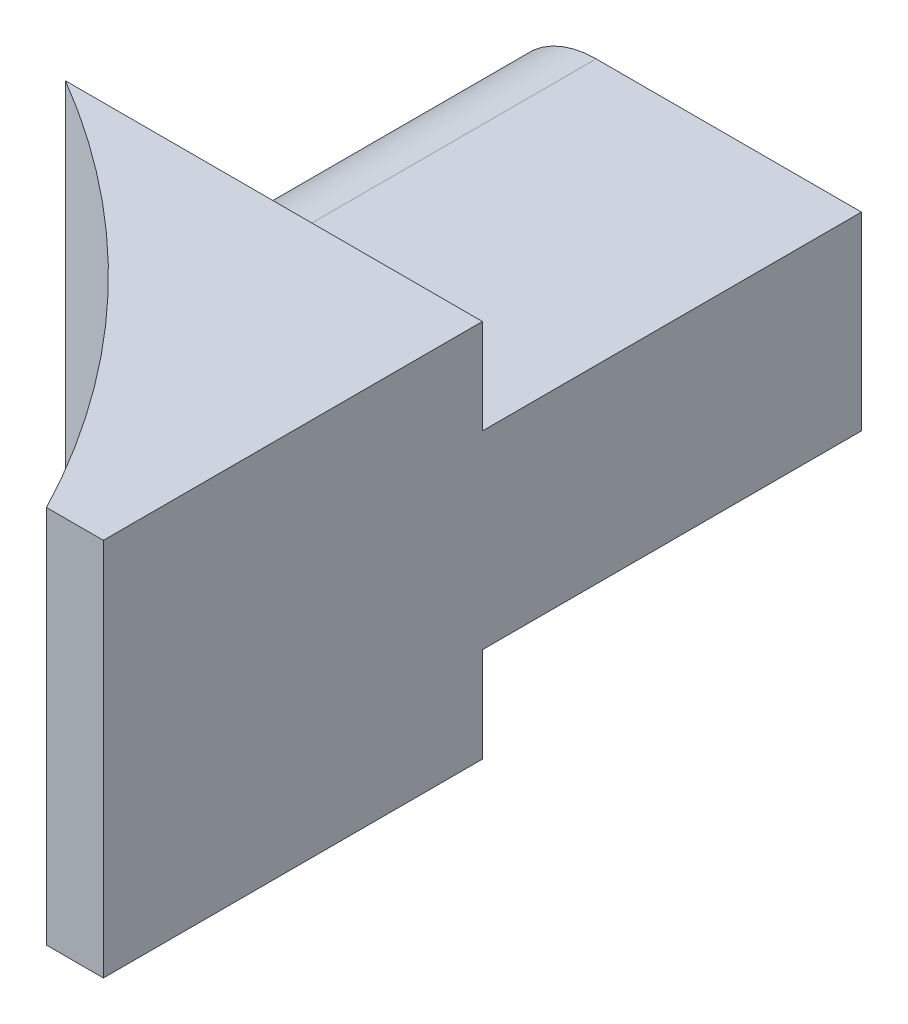
ISO-10303-21;
HEADER;
FILE_DESCRIPTION(('STEP AP214'),'2;1');
FILE_NAME('part.step','',(''),(''),'','','');
FILE_SCHEMA(('AUTOMOTIVE_DESIGN { 1 0 10303 214 1 1 1 1 }'));
ENDSEC;
DATA;
#1=APPLICATION_CONTEXT('core data for automotive mechanical design processes');
#2=APPLICATION_PROTOCOL_DEFINITION('international standard','automotive_design',2000,#1);
#3=PRODUCT_CONTEXT('',#1,'mechanical');
#4=PRODUCT('Part','Part','',(#3));
#5=PRODUCT_RELATED_PRODUCT_CATEGORY('part','',(#4));
#6=PRODUCT_DEFINITION_FORMATION('','',#4);
#7=PRODUCT_DEFINITION_CONTEXT('part definition',#1,'design');
#8=PRODUCT_DEFINITION('design','',#6,#7);
#9=PRODUCT_DEFINITION_SHAPE('','',#8);
#10=(LENGTH_UNIT() NAMED_UNIT(*) SI_UNIT(.MILLI.,.METRE.));
#11=(NAMED_UNIT(*) PLANE_ANGLE_UNIT() SI_UNIT($,.RADIAN.));
#12=(NAMED_UNIT(*) SI_UNIT($,.STERADIAN.) SOLID_ANGLE_UNIT());
#13=UNCERTAINTY_MEASURE_WITH_UNIT(LENGTH_MEASURE(1.E-05),#10,'distance_accuracy_value','');
#14=(GEOMETRIC_REPRESENTATION_CONTEXT(3) GLOBAL_UNCERTAINTY_ASSIGNED_CONTEXT((#13)) GLOBAL_UNIT_ASSIGNED_CONTEXT((#10,
#11,#12)) REPRESENTATION_CONTEXT('',''));
#15=CARTESIAN_POINT('',(0.,0.,0.));
#16=DIRECTION('',(0.,0.,1.));
#17=DIRECTION('',(1.,0.,0.));
#18=AXIS2_PLACEMENT_3D('',#15,#16,#17);
#19=CARTESIAN_POINT('',(0.,0.,10.));
#20=DIRECTION('',(0.,0.,-1.));
#21=DIRECTION('',(-1.,0.,0.));
#22=AXIS2_PLACEMENT_3D('',#19,#20,#21);
#23=CYLINDRICAL_SURFACE('',#22,2.5);
#24=DIRECTION('',(0.,0.,-1.));
#25=VECTOR('',#24,1.);
#26=CARTESIAN_POINT('',(0.,-2.5,10.));
#27=LINE('',#26,#25);
#28=CARTESIAN_POINT('',(0.,-2.5,10.));
#29=VERTEX_POINT('',#28);
#30=CARTESIAN_POINT('',(0.,-2.5,0.));
#31=VERTEX_POINT('',#30);
#32=EDGE_CURVE('E187',#29,#31,#27,.T.);
#33=ORIENTED_EDGE('',*,*,#32,.F.);
#34=CARTESIAN_POINT('',(0.,0.,10.));
#35=DIRECTION('',(0.,0.,1.));
#36=DIRECTION('',(1.,0.,0.));
#37=AXIS2_PLACEMENT_3D('',#34,#35,#36);
#38=CIRCLE('',#37,2.5);
#39=CARTESIAN_POINT('',(0.,2.5,10.));
#40=VERTEX_POINT('',#39);
#41=EDGE_CURVE('E121',#40,#29,#38,.T.);
#42=ORIENTED_EDGE('',*,*,#41,.F.);
#43=DIRECTION('',(0.,0.,-1.));
#44=VECTOR('',#43,1.);
#45=CARTESIAN_POINT('',(0.,2.5,10.));
#46=LINE('',#45,#44);
#47=CARTESIAN_POINT('',(0.,2.5,0.));
#48=VERTEX_POINT('',#47);
#49=EDGE_CURVE('E48',#40,#48,#46,.T.);
#50=ORIENTED_EDGE('',*,*,#49,.T.);
#51=CARTESIAN_POINT('',(0.,0.,0.));
#52=DIRECTION('',(0.,0.,1.));
#53=DIRECTION('',(1.,0.,0.));
#54=AXIS2_PLACEMENT_3D('',#51,#52,#53);
#55=CIRCLE('',#54,2.5);
#56=EDGE_CURVE('E120',#48,#31,#55,.T.);
#57=ORIENTED_EDGE('',*,*,#56,.T.);
#58=EDGE_LOOP('',(#33,#42,#50,#57));
#59=FACE_BOUND('',#58,.T.);
#60=ADVANCED_FACE('F33',(#59),#23,.T.);
#61=CARTESIAN_POINT('',(0.,0.,0.));
#62=DIRECTION('',(0.,0.,1.));
#63=DIRECTION('',(1.,0.,0.));
#64=AXIS2_PLACEMENT_3D('',#61,#62,#63);
#65=PLANE('',#64);
#66=CARTESIAN_POINT('',(0.,0.,0.));
#67=DIRECTION('',(0.,0.,-1.));
#68=DIRECTION('',(-1.,0.,0.));
#69=AXIS2_PLACEMENT_3D('',#66,#67,#68);
#70=CIRCLE('',#69,1.5);
#71=CARTESIAN_POINT('',(-1.5,0.,0.));
#72=VERTEX_POINT('',#71);
#73=EDGE_CURVE('E117',#72,#72,#70,.T.);
#74=ORIENTED_EDGE('',*,*,#73,.F.);
#75=EDGE_LOOP('',(#74));
#76=FACE_BOUND('',#75,.T.);
#77=ORIENTED_EDGE('',*,*,#56,.F.);
#78=DIRECTION('',(1.,0.,0.));
#79=VECTOR('',#78,1.);
#80=CARTESIAN_POINT('',(7.,2.5,0.));
#81=LINE('',#80,#79);
#82=CARTESIAN_POINT('',(7.,2.5,0.));
#83=VERTEX_POINT('',#82);
#84=EDGE_CURVE('E198',#48,#83,#81,.T.);
#85=ORIENTED_EDGE('',*,*,#84,.T.);
#86=DIRECTION('',(0.,-1.,0.));
#87=VECTOR('',#86,1.);
#88=CARTESIAN_POINT('',(7.,-2.5,0.));
#89=LINE('',#88,#87);
#90=CARTESIAN_POINT('',(7.,-2.5,0.));
#91=VERTEX_POINT('',#90);
#92=EDGE_CURVE('E194',#83,#91,#89,.T.);
#93=ORIENTED_EDGE('',*,*,#92,.T.);
#94=DIRECTION('',(-1.,0.,0.));
#95=VECTOR('',#94,1.);
#96=CARTESIAN_POINT('',(0.,-2.5,0.));
#97=LINE('',#96,#95);
#98=EDGE_CURVE('E180',#91,#31,#97,.T.);
#99=ORIENTED_EDGE('',*,*,#98,.T.);
#100=EDGE_LOOP('',(#77,#85,#93,#99));
#101=FACE_BOUND('',#100,.T.);
#102=ADVANCED_FACE('F143',(#76,#101),#65,.F.);
#103=CARTESIAN_POINT('',(0.,0.,0.9));
#104=DIRECTION('',(0.,0.,-1.));
#105=DIRECTION('',(-1.,0.,0.));
#106=AXIS2_PLACEMENT_3D('',#103,#104,#105);
#107=CYLINDRICAL_SURFACE('',#106,1.5);
#108=CARTESIAN_POINT('',(0.,0.,0.8));
#109=DIRECTION('',(0.,0.,-1.));
#110=DIRECTION('',(-1.,0.,0.));
#111=AXIS2_PLACEMENT_3D('',#108,#109,#110);
#112=CIRCLE('',#111,1.5);
#113=CARTESIAN_POINT('',(-1.5,0.,0.8));
#114=VERTEX_POINT('',#113);
#115=EDGE_CURVE('E11',#114,#114,#112,.F.);
#116=ORIENTED_EDGE('',*,*,#115,.T.);
#117=EDGE_LOOP('',(#116));
#118=FACE_BOUND('',#117,.T.);
#119=ORIENTED_EDGE('',*,*,#73,.T.);
#120=EDGE_LOOP('',(#119));
#121=FACE_BOUND('',#120,.T.);
#122=ADVANCED_FACE('F139',(#118,#121),#107,.F.);
#123=CARTESIAN_POINT('',(0.,0.,0.9));
#124=DIRECTION('',(0.,0.,-1.));
#125=DIRECTION('',(-1.,0.,0.));
#126=AXIS2_PLACEMENT_3D('',#123,#124,#125);
#127=PLANE('',#126);
#128=CARTESIAN_POINT('',(0.,0.,0.9));
#129=DIRECTION('',(0.,0.,-1.));
#130=DIRECTION('',(-1.,0.,0.));
#131=AXIS2_PLACEMENT_3D('',#128,#129,#130);
#132=CIRCLE('',#131,1.4);
#133=CARTESIAN_POINT('',(-1.4,0.,0.9));
#134=VERTEX_POINT('',#133);
#135=EDGE_CURVE('E41',#134,#134,#132,.T.);
#136=ORIENTED_EDGE('',*,*,#135,.T.);
#137=EDGE_LOOP('',(#136));
#138=FACE_BOUND('',#137,.T.);
#139=ADVANCED_FACE('F127',(#138),#127,.T.);
#140=CARTESIAN_POINT('',(0.,0.,0.8));
#141=DIRECTION('',(0.,0.,-1.));
#142=DIRECTION('',(-1.,0.,0.));
#143=AXIS2_PLACEMENT_3D('',#140,#141,#142);
#144=TOROIDAL_SURFACE('',#143,1.4,0.1);
#145=ORIENTED_EDGE('',*,*,#115,.F.);
#146=EDGE_LOOP('',(#145));
#147=FACE_BOUND('',#146,.T.);
#148=ORIENTED_EDGE('',*,*,#135,.F.);
#149=EDGE_LOOP('',(#148));
#150=FACE_BOUND('',#149,.T.);
#151=ADVANCED_FACE('F35',(#147,#150),#144,.F.);
#152=CARTESIAN_POINT('',(-4.,-5.,20.));
#153=DIRECTION('',(0.,1.,0.));
#154=DIRECTION('',(0.,0.,1.));
#155=AXIS2_PLACEMENT_3D('',#152,#153,#154);
#156=PLANE('',#155);
#157=DIRECTION('',(1.,0.,0.));
#158=VECTOR('',#157,1.);
#159=CARTESIAN_POINT('',(-4.,-5.,20.));
#160=LINE('',#159,#158);
#161=CARTESIAN_POINT('',(5.5,-5.,20.));
#162=VERTEX_POINT('',#161);
#163=CARTESIAN_POINT('',(7.,-5.,20.));
#164=VERTEX_POINT('',#163);
#165=EDGE_CURVE('E95',#162,#164,#160,.T.);
#166=ORIENTED_EDGE('',*,*,#165,.F.);
#167=CARTESIAN_POINT('',(-16.6716850991842,-5.,31.550600844225));
#168=DIRECTION('',(0.,-1.,0.));
#169=DIRECTION('',(0.,0.,1.));
#170=AXIS2_PLACEMENT_3D('',#167,#168,#169);
#171=CIRCLE('',#170,25.);
#172=CARTESIAN_POINT('',(-4.,-5.,10.));
#173=VERTEX_POINT('',#172);
#174=EDGE_CURVE('E86',#173,#162,#171,.T.);
#175=ORIENTED_EDGE('',*,*,#174,.F.);
#176=DIRECTION('',(1.,0.,0.));
#177=VECTOR('',#176,1.);
#178=CARTESIAN_POINT('',(-4.,-5.,10.));
#179=LINE('',#178,#177);
#180=CARTESIAN_POINT('',(7.,-5.,10.));
#181=VERTEX_POINT('',#180);
#182=EDGE_CURVE('E102',#173,#181,#179,.T.);
#183=ORIENTED_EDGE('',*,*,#182,.T.);
#184=DIRECTION('',(0.,0.,-1.));
#185=VECTOR('',#184,1.);
#186=CARTESIAN_POINT('',(7.,-5.,20.));
#187=LINE('',#186,#185);
#188=EDGE_CURVE('E114',#164,#181,#187,.T.);
#189=ORIENTED_EDGE('',*,*,#188,.F.);
#190=EDGE_LOOP('',(#166,#175,#183,#189));
#191=FACE_BOUND('',#190,.T.);
#192=ADVANCED_FACE('F130',(#191),#156,.F.);
#193=CARTESIAN_POINT('',(7.,5.,20.));
#194=DIRECTION('',(-1.,0.,0.));
#195=DIRECTION('',(0.,-1.,0.));
#196=AXIS2_PLACEMENT_3D('',#193,#194,#195);
#197=PLANE('',#196);
#198=DIRECTION('',(0.,1.,0.));
#199=VECTOR('',#198,1.);
#200=CARTESIAN_POINT('',(7.,5.,10.));
#201=LINE('',#200,#199);
#202=CARTESIAN_POINT('',(7.,-2.5,10.));
#203=VERTEX_POINT('',#202);
#204=EDGE_CURVE('E96',#181,#203,#201,.T.);
#205=ORIENTED_EDGE('',*,*,#204,.T.);
#206=DIRECTION('',(0.,0.,-1.));
#207=VECTOR('',#206,1.);
#208=CARTESIAN_POINT('',(7.,-2.5,10.));
#209=LINE('',#208,#207);
#210=EDGE_CURVE('E184',#203,#91,#209,.T.);
#211=ORIENTED_EDGE('',*,*,#210,.T.);
#212=ORIENTED_EDGE('',*,*,#92,.F.);
#213=DIRECTION('',(0.,0.,-1.));
#214=VECTOR('',#213,1.);
#215=CARTESIAN_POINT('',(7.,2.5,10.));
#216=LINE('',#215,#214);
#217=CARTESIAN_POINT('',(7.,2.5,10.));
#218=VERTEX_POINT('',#217);
#219=EDGE_CURVE('E204',#218,#83,#216,.T.);
#220=ORIENTED_EDGE('',*,*,#219,.F.);
#221=CARTESIAN_POINT('',(7.,5.,10.));
#222=VERTEX_POINT('',#221);
#223=EDGE_CURVE('E104',#218,#222,#201,.T.);
#224=ORIENTED_EDGE('',*,*,#223,.T.);
#225=DIRECTION('',(0.,0.,-1.));
#226=VECTOR('',#225,1.);
#227=CARTESIAN_POINT('',(7.,5.,20.));
#228=LINE('',#227,#226);
#229=CARTESIAN_POINT('',(7.,5.,20.));
#230=VERTEX_POINT('',#229);
#231=EDGE_CURVE('E92',#230,#222,#228,.T.);
#232=ORIENTED_EDGE('',*,*,#231,.F.);
#233=DIRECTION('',(0.,1.,0.));
#234=VECTOR('',#233,1.);
#235=CARTESIAN_POINT('',(7.,5.,20.));
#236=LINE('',#235,#234);
#237=EDGE_CURVE('E57',#164,#230,#236,.T.);
#238=ORIENTED_EDGE('',*,*,#237,.F.);
#239=ORIENTED_EDGE('',*,*,#188,.T.);
#240=EDGE_LOOP('',(#205,#211,#212,#220,#224,#232,#238,#239));
#241=FACE_BOUND('',#240,.T.);
#242=ADVANCED_FACE('F136',(#241),#197,.F.);
#243=CARTESIAN_POINT('',(-4.,5.,20.));
#244=DIRECTION('',(0.,-1.,0.));
#245=DIRECTION('',(0.,0.,-1.));
#246=AXIS2_PLACEMENT_3D('',#243,#244,#245);
#247=PLANE('',#246);
#248=DIRECTION('',(-1.,0.,0.));
#249=VECTOR('',#248,1.);
#250=CARTESIAN_POINT('',(-4.,5.,10.));
#251=LINE('',#250,#249);
#252=CARTESIAN_POINT('',(-4.,5.,10.));
#253=VERTEX_POINT('',#252);
#254=EDGE_CURVE('E90',#222,#253,#251,.T.);
#255=ORIENTED_EDGE('',*,*,#254,.T.);
#256=CARTESIAN_POINT('',(-16.6716850991842,5.,31.550600844225));
#257=DIRECTION('',(0.,-1.,0.));
#258=DIRECTION('',(0.,0.,1.));
#259=AXIS2_PLACEMENT_3D('',#256,#257,#258);
#260=CIRCLE('',#259,25.);
#261=CARTESIAN_POINT('',(5.5,5.,20.));
#262=VERTEX_POINT('',#261);
#263=EDGE_CURVE('E74',#253,#262,#260,.T.);
#264=ORIENTED_EDGE('',*,*,#263,.T.);
#265=DIRECTION('',(-1.,0.,0.));
#266=VECTOR('',#265,1.);
#267=CARTESIAN_POINT('',(-4.,5.,20.));
#268=LINE('',#267,#266);
#269=EDGE_CURVE('E108',#230,#262,#268,.T.);
#270=ORIENTED_EDGE('',*,*,#269,.F.);
#271=ORIENTED_EDGE('',*,*,#231,.T.);
#272=EDGE_LOOP('',(#255,#264,#270,#271));
#273=FACE_BOUND('',#272,.T.);
#274=ADVANCED_FACE('F91',(#273),#247,.F.);
#275=CARTESIAN_POINT('',(0.,0.,20.));
#276=DIRECTION('',(0.,0.,1.));
#277=DIRECTION('',(1.,0.,0.));
#278=AXIS2_PLACEMENT_3D('',#275,#276,#277);
#279=PLANE('',#278);
#280=DIRECTION('',(0.,-1.,0.));
#281=VECTOR('',#280,1.);
#282=CARTESIAN_POINT('',(5.5,5.,20.));
#283=LINE('',#282,#281);
#284=EDGE_CURVE('E83',#262,#162,#283,.T.);
#285=ORIENTED_EDGE('',*,*,#284,.T.);
#286=ORIENTED_EDGE('',*,*,#165,.T.);
#287=ORIENTED_EDGE('',*,*,#237,.T.);
#288=ORIENTED_EDGE('',*,*,#269,.T.);
#289=EDGE_LOOP('',(#285,#286,#287,#288));
#290=FACE_BOUND('',#289,.T.);
#291=ADVANCED_FACE('F160',(#290),#279,.T.);
#292=CARTESIAN_POINT('',(0.,0.,10.));
#293=DIRECTION('',(0.,0.,1.));
#294=DIRECTION('',(1.,0.,0.));
#295=AXIS2_PLACEMENT_3D('',#292,#293,#294);
#296=PLANE('',#295);
#297=ORIENTED_EDGE('',*,*,#41,.T.);
#298=DIRECTION('',(-1.,0.,0.));
#299=VECTOR('',#298,1.);
#300=CARTESIAN_POINT('',(0.,-2.5,10.));
#301=LINE('',#300,#299);
#302=EDGE_CURVE('E196',#203,#29,#301,.T.);
#303=ORIENTED_EDGE('',*,*,#302,.F.);
#304=ORIENTED_EDGE('',*,*,#204,.F.);
#305=ORIENTED_EDGE('',*,*,#182,.F.);
#306=DIRECTION('',(0.,-1.,0.));
#307=VECTOR('',#306,1.);
#308=CARTESIAN_POINT('',(-4.,5.,10.));
#309=LINE('',#308,#307);
#310=EDGE_CURVE('E80',#253,#173,#309,.T.);
#311=ORIENTED_EDGE('',*,*,#310,.F.);
#312=ORIENTED_EDGE('',*,*,#254,.F.);
#313=ORIENTED_EDGE('',*,*,#223,.F.);
#314=DIRECTION('',(1.,0.,0.));
#315=VECTOR('',#314,1.);
#316=CARTESIAN_POINT('',(7.,2.5,10.));
#317=LINE('',#316,#315);
#318=EDGE_CURVE('E193',#40,#218,#317,.T.);
#319=ORIENTED_EDGE('',*,*,#318,.F.);
#320=EDGE_LOOP('',(#297,#303,#304,#305,#311,#312,#313,#319));
#321=FACE_BOUND('',#320,.T.);
#322=ADVANCED_FACE('F100',(#321),#296,.F.);
#323=CARTESIAN_POINT('',(-16.6716850991842,5.,31.550600844225));
#324=DIRECTION('',(0.,-1.,0.));
#325=DIRECTION('',(0.,0.,-1.));
#326=AXIS2_PLACEMENT_3D('',#323,#324,#325);
#327=CYLINDRICAL_SURFACE('',#326,25.);
#328=ORIENTED_EDGE('',*,*,#174,.T.);
#329=ORIENTED_EDGE('',*,*,#284,.F.);
#330=ORIENTED_EDGE('',*,*,#263,.F.);
#331=ORIENTED_EDGE('',*,*,#310,.T.);
#332=EDGE_LOOP('',(#328,#329,#330,#331));
#333=FACE_BOUND('',#332,.T.);
#334=ADVANCED_FACE('F77',(#333),#327,.F.);
#335=CARTESIAN_POINT('',(0.,-2.5,10.));
#336=DIRECTION('',(0.,-1.,0.));
#337=DIRECTION('',(1.,0.,0.));
#338=AXIS2_PLACEMENT_3D('',#335,#336,#337);
#339=PLANE('',#338);
#340=ORIENTED_EDGE('',*,*,#98,.F.);
#341=ORIENTED_EDGE('',*,*,#210,.F.);
#342=ORIENTED_EDGE('',*,*,#302,.T.);
#343=ORIENTED_EDGE('',*,*,#32,.T.);
#344=EDGE_LOOP('',(#340,#341,#342,#343));
#345=FACE_BOUND('',#344,.T.);
#346=ADVANCED_FACE('F167',(#345),#339,.T.);
#347=CARTESIAN_POINT('',(7.,2.5,10.));
#348=DIRECTION('',(0.,1.,0.));
#349=DIRECTION('',(0.,0.,1.));
#350=AXIS2_PLACEMENT_3D('',#347,#348,#349);
#351=PLANE('',#350);
#352=ORIENTED_EDGE('',*,*,#84,.F.);
#353=ORIENTED_EDGE('',*,*,#49,.F.);
#354=ORIENTED_EDGE('',*,*,#318,.T.);
#355=ORIENTED_EDGE('',*,*,#219,.T.);
#356=EDGE_LOOP('',(#352,#353,#354,#355));
#357=FACE_BOUND('',#356,.T.);
#358=ADVANCED_FACE('F168',(#357),#351,.T.);
#359=CLOSED_SHELL('',(#60,#102,#122,#139,#151,#192,#242,#274,#291,#322,#334,#346,#358));
#360=MANIFOLD_SOLID_BREP('B2',#359);
#361=ADVANCED_BREP_SHAPE_REPRESENTATION('',(#18,#360),#14);
#362=SHAPE_DEFINITION_REPRESENTATION(#9,#361);
ENDSEC;
END-ISO-10303-21;
